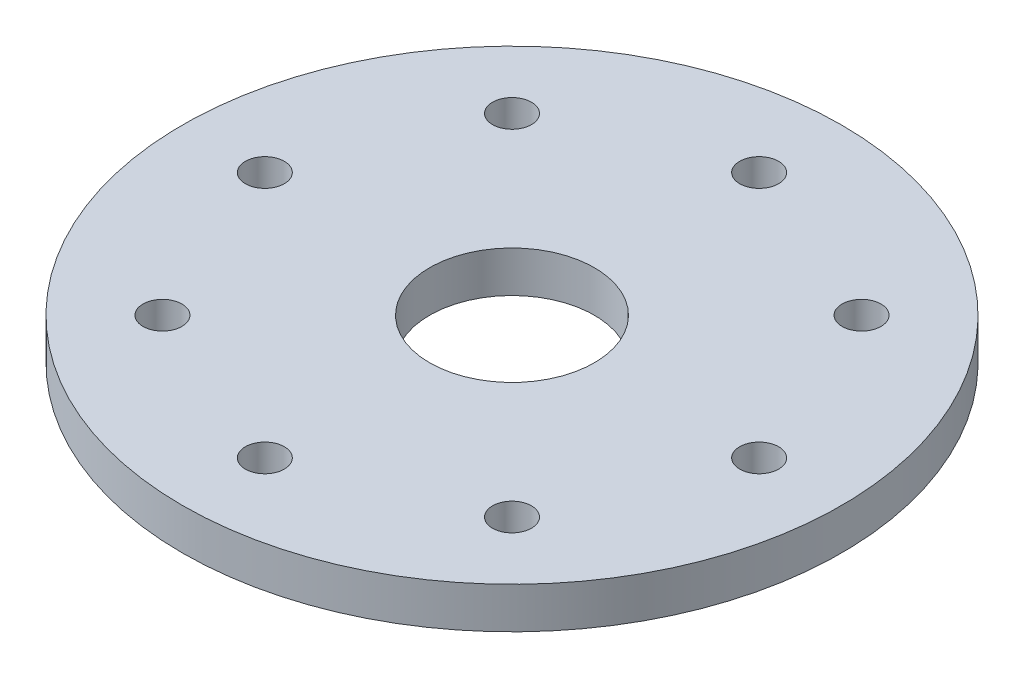
ISO-10303-21;
HEADER;
FILE_DESCRIPTION(('STEP AP214'),'2;1');
FILE_NAME('part.step','',(''),(''),'','','');
FILE_SCHEMA(('AUTOMOTIVE_DESIGN { 1 0 10303 214 1 1 1 1 }'));
ENDSEC;
DATA;
#1=APPLICATION_CONTEXT('core data for automotive mechanical design processes');
#2=APPLICATION_PROTOCOL_DEFINITION('international standard','automotive_design',2000,#1);
#3=PRODUCT_CONTEXT('',#1,'mechanical');
#4=PRODUCT('Part','Part','',(#3));
#5=PRODUCT_RELATED_PRODUCT_CATEGORY('part','',(#4));
#6=PRODUCT_DEFINITION_FORMATION('','',#4);
#7=PRODUCT_DEFINITION_CONTEXT('part definition',#1,'design');
#8=PRODUCT_DEFINITION('design','',#6,#7);
#9=PRODUCT_DEFINITION_SHAPE('','',#8);
#10=(LENGTH_UNIT() NAMED_UNIT(*) SI_UNIT(.MILLI.,.METRE.));
#11=(NAMED_UNIT(*) PLANE_ANGLE_UNIT() SI_UNIT($,.RADIAN.));
#12=(NAMED_UNIT(*) SI_UNIT($,.STERADIAN.) SOLID_ANGLE_UNIT());
#13=UNCERTAINTY_MEASURE_WITH_UNIT(LENGTH_MEASURE(1.E-05),#10,'distance_accuracy_value','');
#14=(GEOMETRIC_REPRESENTATION_CONTEXT(3) GLOBAL_UNCERTAINTY_ASSIGNED_CONTEXT((#13)) GLOBAL_UNIT_ASSIGNED_CONTEXT((#10,
#11,#12)) REPRESENTATION_CONTEXT('',''));
#15=CARTESIAN_POINT('',(0.,0.,0.));
#16=DIRECTION('',(0.,0.,1.));
#17=DIRECTION('',(1.,0.,0.));
#18=AXIS2_PLACEMENT_3D('',#15,#16,#17);
#19=CARTESIAN_POINT('',(0.,3.175,0.));
#20=DIRECTION('',(0.,1.,0.));
#21=DIRECTION('',(0.,0.,1.));
#22=AXIS2_PLACEMENT_3D('',#19,#20,#21);
#23=PLANE('',#22);
#24=CARTESIAN_POINT('',(-19.05,3.175,0.));
#25=DIRECTION('',(0.,1.,0.));
#26=DIRECTION('',(0.,0.,1.));
#27=AXIS2_PLACEMENT_3D('',#24,#25,#26);
#28=CIRCLE('',#27,1.500000048);
#29=CARTESIAN_POINT('',(-19.05,3.175,1.500000048));
#30=VERTEX_POINT('',#29);
#31=EDGE_CURVE('E86',#30,#30,#28,.T.);
#32=ORIENTED_EDGE('',*,*,#31,.F.);
#33=EDGE_LOOP('',(#32));
#34=FACE_BOUND('',#33,.T.);
#35=CARTESIAN_POINT('',(13.4703841816037,3.175,13.4703841816037));
#36=DIRECTION('',(0.,1.,0.));
#37=DIRECTION('',(0.,0.,1.));
#38=AXIS2_PLACEMENT_3D('',#35,#36,#37);
#39=CIRCLE('',#38,1.500000048);
#40=CARTESIAN_POINT('',(13.4703841816037,3.175,14.9703842296037));
#41=VERTEX_POINT('',#40);
#42=EDGE_CURVE('E74',#41,#41,#39,.T.);
#43=ORIENTED_EDGE('',*,*,#42,.F.);
#44=EDGE_LOOP('',(#43));
#45=FACE_BOUND('',#44,.T.);
#46=CARTESIAN_POINT('',(13.4703841816037,3.175,-13.4703841816037));
#47=DIRECTION('',(0.,1.,0.));
#48=DIRECTION('',(0.,0.,1.));
#49=AXIS2_PLACEMENT_3D('',#46,#47,#48);
#50=CIRCLE('',#49,1.500000048);
#51=CARTESIAN_POINT('',(13.4703841816037,3.175,-11.9703841336037));
#52=VERTEX_POINT('',#51);
#53=EDGE_CURVE('E62',#52,#52,#50,.T.);
#54=ORIENTED_EDGE('',*,*,#53,.F.);
#55=EDGE_LOOP('',(#54));
#56=FACE_BOUND('',#55,.T.);
#57=CARTESIAN_POINT('',(0.,3.175,-19.05));
#58=DIRECTION('',(0.,1.,0.));
#59=DIRECTION('',(0.,0.,1.));
#60=AXIS2_PLACEMENT_3D('',#57,#58,#59);
#61=CIRCLE('',#60,1.500000048);
#62=CARTESIAN_POINT('',(0.,3.175,-17.549999952));
#63=VERTEX_POINT('',#62);
#64=EDGE_CURVE('E50',#63,#63,#61,.T.);
#65=ORIENTED_EDGE('',*,*,#64,.F.);
#66=EDGE_LOOP('',(#65));
#67=FACE_BOUND('',#66,.T.);
#68=CARTESIAN_POINT('',(0.,3.175,0.));
#69=DIRECTION('',(0.,1.,0.));
#70=DIRECTION('',(0.,0.,1.));
#71=AXIS2_PLACEMENT_3D('',#68,#69,#70);
#72=CIRCLE('',#71,25.4);
#73=CARTESIAN_POINT('',(0.,3.175,25.4));
#74=VERTEX_POINT('',#73);
#75=EDGE_CURVE('E10',#74,#74,#72,.T.);
#76=ORIENTED_EDGE('',*,*,#75,.T.);
#77=EDGE_LOOP('',(#76));
#78=FACE_BOUND('',#77,.T.);
#79=CARTESIAN_POINT('',(0.,3.175,0.));
#80=DIRECTION('',(0.,1.,0.));
#81=DIRECTION('',(0.,0.,1.));
#82=AXIS2_PLACEMENT_3D('',#79,#80,#81);
#83=CIRCLE('',#82,6.35);
#84=CARTESIAN_POINT('',(0.,3.175,6.35));
#85=VERTEX_POINT('',#84);
#86=EDGE_CURVE('E45',#85,#85,#83,.T.);
#87=ORIENTED_EDGE('',*,*,#86,.F.);
#88=EDGE_LOOP('',(#87));
#89=FACE_BOUND('',#88,.T.);
#90=CARTESIAN_POINT('',(0.,3.175,19.05));
#91=DIRECTION('',(0.,1.,0.));
#92=DIRECTION('',(0.,0.,1.));
#93=AXIS2_PLACEMENT_3D('',#90,#91,#92);
#94=CIRCLE('',#93,1.500000048);
#95=CARTESIAN_POINT('',(0.,3.175,20.550000048));
#96=VERTEX_POINT('',#95);
#97=EDGE_CURVE('E56',#96,#96,#94,.T.);
#98=ORIENTED_EDGE('',*,*,#97,.F.);
#99=EDGE_LOOP('',(#98));
#100=FACE_BOUND('',#99,.T.);
#101=CARTESIAN_POINT('',(19.05,3.175,0.));
#102=DIRECTION('',(0.,1.,0.));
#103=DIRECTION('',(0.,0.,1.));
#104=AXIS2_PLACEMENT_3D('',#101,#102,#103);
#105=CIRCLE('',#104,1.500000048);
#106=CARTESIAN_POINT('',(19.05,3.175,1.500000048));
#107=VERTEX_POINT('',#106);
#108=EDGE_CURVE('E68',#107,#107,#105,.T.);
#109=ORIENTED_EDGE('',*,*,#108,.F.);
#110=EDGE_LOOP('',(#109));
#111=FACE_BOUND('',#110,.T.);
#112=CARTESIAN_POINT('',(-13.4703841816037,3.175,13.4703841816037));
#113=DIRECTION('',(0.,1.,0.));
#114=DIRECTION('',(0.,0.,1.));
#115=AXIS2_PLACEMENT_3D('',#112,#113,#114);
#116=CIRCLE('',#115,1.500000048);
#117=CARTESIAN_POINT('',(-13.4703841816037,3.175,14.9703842296037));
#118=VERTEX_POINT('',#117);
#119=EDGE_CURVE('E80',#118,#118,#116,.T.);
#120=ORIENTED_EDGE('',*,*,#119,.F.);
#121=EDGE_LOOP('',(#120));
#122=FACE_BOUND('',#121,.T.);
#123=CARTESIAN_POINT('',(-13.4703841816037,3.175,-13.4703841816037));
#124=DIRECTION('',(0.,1.,0.));
#125=DIRECTION('',(0.,0.,1.));
#126=AXIS2_PLACEMENT_3D('',#123,#124,#125);
#127=CIRCLE('',#126,1.500000048);
#128=CARTESIAN_POINT('',(-13.4703841816037,3.175,-11.9703841336037));
#129=VERTEX_POINT('',#128);
#130=EDGE_CURVE('E92',#129,#129,#127,.T.);
#131=ORIENTED_EDGE('',*,*,#130,.F.);
#132=EDGE_LOOP('',(#131));
#133=FACE_BOUND('',#132,.T.);
#134=ADVANCED_FACE('F34',(#34,#45,#56,#67,#78,#89,#100,#111,#122,#133),#23,.T.);
#135=CARTESIAN_POINT('',(0.,0.,0.));
#136=DIRECTION('',(0.,1.,0.));
#137=DIRECTION('',(0.,0.,1.));
#138=AXIS2_PLACEMENT_3D('',#135,#136,#137);
#139=PLANE('',#138);
#140=CARTESIAN_POINT('',(0.,0.,0.));
#141=DIRECTION('',(0.,1.,0.));
#142=DIRECTION('',(0.,0.,1.));
#143=AXIS2_PLACEMENT_3D('',#140,#141,#142);
#144=CIRCLE('',#143,25.4);
#145=CARTESIAN_POINT('',(0.,0.,25.4));
#146=VERTEX_POINT('',#145);
#147=EDGE_CURVE('E38',#146,#146,#144,.T.);
#148=ORIENTED_EDGE('',*,*,#147,.F.);
#149=EDGE_LOOP('',(#148));
#150=FACE_BOUND('',#149,.T.);
#151=CARTESIAN_POINT('',(0.,0.,0.));
#152=DIRECTION('',(0.,1.,0.));
#153=DIRECTION('',(0.,0.,1.));
#154=AXIS2_PLACEMENT_3D('',#151,#152,#153);
#155=CIRCLE('',#154,6.35);
#156=CARTESIAN_POINT('',(0.,0.,6.35));
#157=VERTEX_POINT('',#156);
#158=EDGE_CURVE('E47',#157,#157,#155,.T.);
#159=ORIENTED_EDGE('',*,*,#158,.T.);
#160=EDGE_LOOP('',(#159));
#161=FACE_BOUND('',#160,.T.);
#162=CARTESIAN_POINT('',(0.,0.,-19.05));
#163=DIRECTION('',(0.,1.,0.));
#164=DIRECTION('',(0.,0.,1.));
#165=AXIS2_PLACEMENT_3D('',#162,#163,#164);
#166=CIRCLE('',#165,1.500000048);
#167=CARTESIAN_POINT('',(0.,0.,-17.549999952));
#168=VERTEX_POINT('',#167);
#169=EDGE_CURVE('E53',#168,#168,#166,.T.);
#170=ORIENTED_EDGE('',*,*,#169,.T.);
#171=EDGE_LOOP('',(#170));
#172=FACE_BOUND('',#171,.T.);
#173=CARTESIAN_POINT('',(0.,0.,19.05));
#174=DIRECTION('',(0.,1.,0.));
#175=DIRECTION('',(0.,0.,1.));
#176=AXIS2_PLACEMENT_3D('',#173,#174,#175);
#177=CIRCLE('',#176,1.500000048);
#178=CARTESIAN_POINT('',(0.,0.,20.550000048));
#179=VERTEX_POINT('',#178);
#180=EDGE_CURVE('E59',#179,#179,#177,.T.);
#181=ORIENTED_EDGE('',*,*,#180,.T.);
#182=EDGE_LOOP('',(#181));
#183=FACE_BOUND('',#182,.T.);
#184=CARTESIAN_POINT('',(13.4703841816037,0.,-13.4703841816037));
#185=DIRECTION('',(0.,1.,0.));
#186=DIRECTION('',(0.,0.,1.));
#187=AXIS2_PLACEMENT_3D('',#184,#185,#186);
#188=CIRCLE('',#187,1.500000048);
#189=CARTESIAN_POINT('',(13.4703841816037,0.,-11.9703841336037));
#190=VERTEX_POINT('',#189);
#191=EDGE_CURVE('E65',#190,#190,#188,.T.);
#192=ORIENTED_EDGE('',*,*,#191,.T.);
#193=EDGE_LOOP('',(#192));
#194=FACE_BOUND('',#193,.T.);
#195=CARTESIAN_POINT('',(19.05,0.,0.));
#196=DIRECTION('',(0.,1.,0.));
#197=DIRECTION('',(0.,0.,1.));
#198=AXIS2_PLACEMENT_3D('',#195,#196,#197);
#199=CIRCLE('',#198,1.500000048);
#200=CARTESIAN_POINT('',(19.05,0.,1.500000048));
#201=VERTEX_POINT('',#200);
#202=EDGE_CURVE('E71',#201,#201,#199,.T.);
#203=ORIENTED_EDGE('',*,*,#202,.T.);
#204=EDGE_LOOP('',(#203));
#205=FACE_BOUND('',#204,.T.);
#206=CARTESIAN_POINT('',(13.4703841816037,0.,13.4703841816037));
#207=DIRECTION('',(0.,1.,0.));
#208=DIRECTION('',(0.,0.,1.));
#209=AXIS2_PLACEMENT_3D('',#206,#207,#208);
#210=CIRCLE('',#209,1.500000048);
#211=CARTESIAN_POINT('',(13.4703841816037,0.,14.9703842296037));
#212=VERTEX_POINT('',#211);
#213=EDGE_CURVE('E77',#212,#212,#210,.T.);
#214=ORIENTED_EDGE('',*,*,#213,.T.);
#215=EDGE_LOOP('',(#214));
#216=FACE_BOUND('',#215,.T.);
#217=CARTESIAN_POINT('',(-13.4703841816037,0.,13.4703841816037));
#218=DIRECTION('',(0.,1.,0.));
#219=DIRECTION('',(0.,0.,1.));
#220=AXIS2_PLACEMENT_3D('',#217,#218,#219);
#221=CIRCLE('',#220,1.500000048);
#222=CARTESIAN_POINT('',(-13.4703841816037,0.,14.9703842296037));
#223=VERTEX_POINT('',#222);
#224=EDGE_CURVE('E83',#223,#223,#221,.T.);
#225=ORIENTED_EDGE('',*,*,#224,.T.);
#226=EDGE_LOOP('',(#225));
#227=FACE_BOUND('',#226,.T.);
#228=CARTESIAN_POINT('',(-19.05,0.,0.));
#229=DIRECTION('',(0.,1.,0.));
#230=DIRECTION('',(0.,0.,1.));
#231=AXIS2_PLACEMENT_3D('',#228,#229,#230);
#232=CIRCLE('',#231,1.500000048);
#233=CARTESIAN_POINT('',(-19.05,0.,1.500000048));
#234=VERTEX_POINT('',#233);
#235=EDGE_CURVE('E89',#234,#234,#232,.T.);
#236=ORIENTED_EDGE('',*,*,#235,.T.);
#237=EDGE_LOOP('',(#236));
#238=FACE_BOUND('',#237,.T.);
#239=CARTESIAN_POINT('',(-13.4703841816037,0.,-13.4703841816037));
#240=DIRECTION('',(0.,1.,0.));
#241=DIRECTION('',(0.,0.,1.));
#242=AXIS2_PLACEMENT_3D('',#239,#240,#241);
#243=CIRCLE('',#242,1.500000048);
#244=CARTESIAN_POINT('',(-13.4703841816037,0.,-11.9703841336037));
#245=VERTEX_POINT('',#244);
#246=EDGE_CURVE('E95',#245,#245,#243,.T.);
#247=ORIENTED_EDGE('',*,*,#246,.T.);
#248=EDGE_LOOP('',(#247));
#249=FACE_BOUND('',#248,.T.);
#250=ADVANCED_FACE('F105',(#150,#161,#172,#183,#194,#205,#216,#227,#238,#249),#139,.F.);
#251=CARTESIAN_POINT('',(0.,3.175,0.));
#252=DIRECTION('',(0.,-1.,0.));
#253=DIRECTION('',(0.,0.,-1.));
#254=AXIS2_PLACEMENT_3D('',#251,#252,#253);
#255=CYLINDRICAL_SURFACE('',#254,25.4);
#256=ORIENTED_EDGE('',*,*,#75,.F.);
#257=EDGE_LOOP('',(#256));
#258=FACE_BOUND('',#257,.T.);
#259=ORIENTED_EDGE('',*,*,#147,.T.);
#260=EDGE_LOOP('',(#259));
#261=FACE_BOUND('',#260,.T.);
#262=ADVANCED_FACE('F36',(#258,#261),#255,.T.);
#263=CARTESIAN_POINT('',(0.,3.175,0.));
#264=DIRECTION('',(0.,-1.,0.));
#265=DIRECTION('',(0.,0.,-1.));
#266=AXIS2_PLACEMENT_3D('',#263,#264,#265);
#267=CYLINDRICAL_SURFACE('',#266,6.35);
#268=ORIENTED_EDGE('',*,*,#86,.T.);
#269=EDGE_LOOP('',(#268));
#270=FACE_BOUND('',#269,.T.);
#271=ORIENTED_EDGE('',*,*,#158,.F.);
#272=EDGE_LOOP('',(#271));
#273=FACE_BOUND('',#272,.T.);
#274=ADVANCED_FACE('F115',(#270,#273),#267,.F.);
#275=CARTESIAN_POINT('',(0.,3.175,-19.05));
#276=DIRECTION('',(0.,-1.,0.));
#277=DIRECTION('',(0.,0.,-1.));
#278=AXIS2_PLACEMENT_3D('',#275,#276,#277);
#279=CYLINDRICAL_SURFACE('',#278,1.500000048);
#280=ORIENTED_EDGE('',*,*,#64,.T.);
#281=EDGE_LOOP('',(#280));
#282=FACE_BOUND('',#281,.T.);
#283=ORIENTED_EDGE('',*,*,#169,.F.);
#284=EDGE_LOOP('',(#283));
#285=FACE_BOUND('',#284,.T.);
#286=ADVANCED_FACE('F118',(#282,#285),#279,.F.);
#287=CARTESIAN_POINT('',(0.,3.175,19.05));
#288=DIRECTION('',(0.,-1.,0.));
#289=DIRECTION('',(0.,0.,-1.));
#290=AXIS2_PLACEMENT_3D('',#287,#288,#289);
#291=CYLINDRICAL_SURFACE('',#290,1.500000048);
#292=ORIENTED_EDGE('',*,*,#97,.T.);
#293=EDGE_LOOP('',(#292));
#294=FACE_BOUND('',#293,.T.);
#295=ORIENTED_EDGE('',*,*,#180,.F.);
#296=EDGE_LOOP('',(#295));
#297=FACE_BOUND('',#296,.T.);
#298=ADVANCED_FACE('F122',(#294,#297),#291,.F.);
#299=CARTESIAN_POINT('',(13.4703841816037,3.175,-13.4703841816037));
#300=DIRECTION('',(0.,-1.,0.));
#301=DIRECTION('',(0.,0.,-1.));
#302=AXIS2_PLACEMENT_3D('',#299,#300,#301);
#303=CYLINDRICAL_SURFACE('',#302,1.500000048);
#304=ORIENTED_EDGE('',*,*,#53,.T.);
#305=EDGE_LOOP('',(#304));
#306=FACE_BOUND('',#305,.T.);
#307=ORIENTED_EDGE('',*,*,#191,.F.);
#308=EDGE_LOOP('',(#307));
#309=FACE_BOUND('',#308,.T.);
#310=ADVANCED_FACE('F126',(#306,#309),#303,.F.);
#311=CARTESIAN_POINT('',(19.05,3.175,0.));
#312=DIRECTION('',(0.,-1.,0.));
#313=DIRECTION('',(0.,0.,-1.));
#314=AXIS2_PLACEMENT_3D('',#311,#312,#313);
#315=CYLINDRICAL_SURFACE('',#314,1.500000048);
#316=ORIENTED_EDGE('',*,*,#108,.T.);
#317=EDGE_LOOP('',(#316));
#318=FACE_BOUND('',#317,.T.);
#319=ORIENTED_EDGE('',*,*,#202,.F.);
#320=EDGE_LOOP('',(#319));
#321=FACE_BOUND('',#320,.T.);
#322=ADVANCED_FACE('F130',(#318,#321),#315,.F.);
#323=CARTESIAN_POINT('',(13.4703841816037,3.175,13.4703841816037));
#324=DIRECTION('',(0.,-1.,0.));
#325=DIRECTION('',(0.,0.,-1.));
#326=AXIS2_PLACEMENT_3D('',#323,#324,#325);
#327=CYLINDRICAL_SURFACE('',#326,1.500000048);
#328=ORIENTED_EDGE('',*,*,#42,.T.);
#329=EDGE_LOOP('',(#328));
#330=FACE_BOUND('',#329,.T.);
#331=ORIENTED_EDGE('',*,*,#213,.F.);
#332=EDGE_LOOP('',(#331));
#333=FACE_BOUND('',#332,.T.);
#334=ADVANCED_FACE('F134',(#330,#333),#327,.F.);
#335=CARTESIAN_POINT('',(-13.4703841816037,3.175,13.4703841816037));
#336=DIRECTION('',(0.,-1.,0.));
#337=DIRECTION('',(0.,0.,-1.));
#338=AXIS2_PLACEMENT_3D('',#335,#336,#337);
#339=CYLINDRICAL_SURFACE('',#338,1.500000048);
#340=ORIENTED_EDGE('',*,*,#119,.T.);
#341=EDGE_LOOP('',(#340));
#342=FACE_BOUND('',#341,.T.);
#343=ORIENTED_EDGE('',*,*,#224,.F.);
#344=EDGE_LOOP('',(#343));
#345=FACE_BOUND('',#344,.T.);
#346=ADVANCED_FACE('F138',(#342,#345),#339,.F.);
#347=CARTESIAN_POINT('',(-19.05,3.175,0.));
#348=DIRECTION('',(0.,-1.,0.));
#349=DIRECTION('',(0.,0.,-1.));
#350=AXIS2_PLACEMENT_3D('',#347,#348,#349);
#351=CYLINDRICAL_SURFACE('',#350,1.500000048);
#352=ORIENTED_EDGE('',*,*,#31,.T.);
#353=EDGE_LOOP('',(#352));
#354=FACE_BOUND('',#353,.T.);
#355=ORIENTED_EDGE('',*,*,#235,.F.);
#356=EDGE_LOOP('',(#355));
#357=FACE_BOUND('',#356,.T.);
#358=ADVANCED_FACE('F142',(#354,#357),#351,.F.);
#359=CARTESIAN_POINT('',(-13.4703841816037,3.175,-13.4703841816037));
#360=DIRECTION('',(0.,-1.,0.));
#361=DIRECTION('',(0.,0.,-1.));
#362=AXIS2_PLACEMENT_3D('',#359,#360,#361);
#363=CYLINDRICAL_SURFACE('',#362,1.500000048);
#364=ORIENTED_EDGE('',*,*,#130,.T.);
#365=EDGE_LOOP('',(#364));
#366=FACE_BOUND('',#365,.T.);
#367=ORIENTED_EDGE('',*,*,#246,.F.);
#368=EDGE_LOOP('',(#367));
#369=FACE_BOUND('',#368,.T.);
#370=ADVANCED_FACE('F101',(#366,#369),#363,.F.);
#371=CLOSED_SHELL('',(#134,#250,#262,#274,#286,#298,#310,#322,#334,#346,#358,#370));
#372=MANIFOLD_SOLID_BREP('B2',#371);
#373=ADVANCED_BREP_SHAPE_REPRESENTATION('',(#18,#372),#14);
#374=SHAPE_DEFINITION_REPRESENTATION(#9,#373);
ENDSEC;
END-ISO-10303-21;
